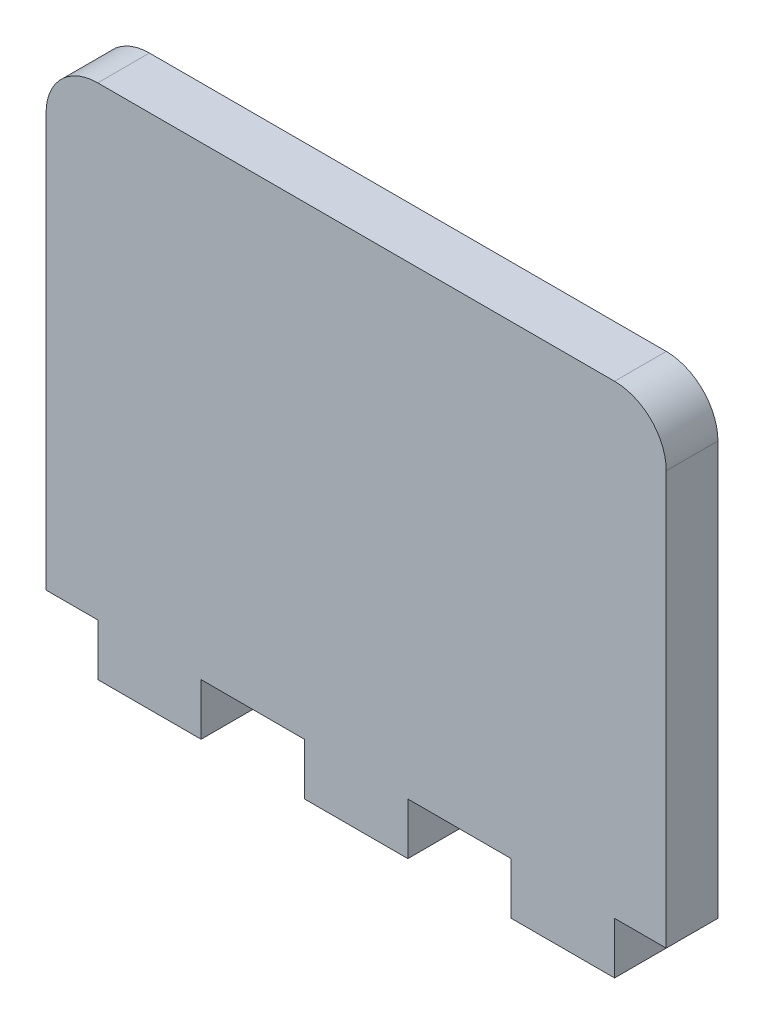
ISO-10303-21;
HEADER;
FILE_DESCRIPTION(('STEP AP214'),'2;1');
FILE_NAME('part.step','',(''),(''),'','','');
FILE_SCHEMA(('AUTOMOTIVE_DESIGN { 1 0 10303 214 1 1 1 1 }'));
ENDSEC;
DATA;
#1=APPLICATION_CONTEXT('core data for automotive mechanical design processes');
#2=APPLICATION_PROTOCOL_DEFINITION('international standard','automotive_design',2000,#1);
#3=PRODUCT_CONTEXT('',#1,'mechanical');
#4=PRODUCT('Part','Part','',(#3));
#5=PRODUCT_RELATED_PRODUCT_CATEGORY('part','',(#4));
#6=PRODUCT_DEFINITION_FORMATION('','',#4);
#7=PRODUCT_DEFINITION_CONTEXT('part definition',#1,'design');
#8=PRODUCT_DEFINITION('design','',#6,#7);
#9=PRODUCT_DEFINITION_SHAPE('','',#8);
#10=(LENGTH_UNIT() NAMED_UNIT(*) SI_UNIT(.MILLI.,.METRE.));
#11=(NAMED_UNIT(*) PLANE_ANGLE_UNIT() SI_UNIT($,.RADIAN.));
#12=(NAMED_UNIT(*) SI_UNIT($,.STERADIAN.) SOLID_ANGLE_UNIT());
#13=UNCERTAINTY_MEASURE_WITH_UNIT(LENGTH_MEASURE(1.E-05),#10,'distance_accuracy_value','');
#14=(GEOMETRIC_REPRESENTATION_CONTEXT(3) GLOBAL_UNCERTAINTY_ASSIGNED_CONTEXT((#13)) GLOBAL_UNIT_ASSIGNED_CONTEXT((#10,
#11,#12)) REPRESENTATION_CONTEXT('',''));
#15=CARTESIAN_POINT('',(0.,0.,0.));
#16=DIRECTION('',(0.,0.,1.));
#17=DIRECTION('',(1.,0.,0.));
#18=AXIS2_PLACEMENT_3D('',#15,#16,#17);
#19=CARTESIAN_POINT('',(0.,0.,3.175));
#20=DIRECTION('',(1.,0.,0.));
#21=DIRECTION('',(0.,0.,-1.));
#22=AXIS2_PLACEMENT_3D('',#19,#20,#21);
#23=PLANE('',#22);
#24=DIRECTION('',(0.,-1.,0.));
#25=VECTOR('',#24,1.);
#26=CARTESIAN_POINT('',(0.,0.,3.175));
#27=LINE('',#26,#25);
#28=CARTESIAN_POINT('',(0.,25.4,3.175));
#29=VERTEX_POINT('',#28);
#30=CARTESIAN_POINT('',(0.,0.,3.175));
#31=VERTEX_POINT('',#30);
#32=EDGE_CURVE('E158',#29,#31,#27,.T.);
#33=ORIENTED_EDGE('',*,*,#32,.F.);
#34=DIRECTION('',(0.,0.,-1.));
#35=VECTOR('',#34,1.);
#36=CARTESIAN_POINT('',(0.,25.4,3.175));
#37=LINE('',#36,#35);
#38=CARTESIAN_POINT('',(0.,25.4,0.));
#39=VERTEX_POINT('',#38);
#40=EDGE_CURVE('E11',#29,#39,#37,.T.);
#41=ORIENTED_EDGE('',*,*,#40,.T.);
#42=DIRECTION('',(0.,-1.,0.));
#43=VECTOR('',#42,1.);
#44=CARTESIAN_POINT('',(0.,0.,0.));
#45=LINE('',#44,#43);
#46=CARTESIAN_POINT('',(0.,0.,0.));
#47=VERTEX_POINT('',#46);
#48=EDGE_CURVE('E178',#39,#47,#45,.T.);
#49=ORIENTED_EDGE('',*,*,#48,.T.);
#50=DIRECTION('',(0.,0.,-1.));
#51=VECTOR('',#50,1.);
#52=CARTESIAN_POINT('',(0.,0.,3.175));
#53=LINE('',#52,#51);
#54=EDGE_CURVE('E171',#31,#47,#53,.T.);
#55=ORIENTED_EDGE('',*,*,#54,.F.);
#56=EDGE_LOOP('',(#33,#41,#49,#55));
#57=FACE_BOUND('',#56,.T.);
#58=ADVANCED_FACE('F33',(#57),#23,.F.);
#59=CARTESIAN_POINT('',(0.,0.,3.175));
#60=DIRECTION('',(0.,1.,0.));
#61=DIRECTION('',(0.,0.,1.));
#62=AXIS2_PLACEMENT_3D('',#59,#60,#61);
#63=PLANE('',#62);
#64=DIRECTION('',(1.,0.,0.));
#65=VECTOR('',#64,1.);
#66=CARTESIAN_POINT('',(0.,0.,0.));
#67=LINE('',#66,#65);
#68=CARTESIAN_POINT('',(3.175,0.,0.));
#69=VERTEX_POINT('',#68);
#70=EDGE_CURVE('E272',#47,#69,#67,.T.);
#71=ORIENTED_EDGE('',*,*,#70,.T.);
#72=DIRECTION('',(0.,0.,-1.));
#73=VECTOR('',#72,1.);
#74=CARTESIAN_POINT('',(3.175,0.,3.175));
#75=LINE('',#74,#73);
#76=CARTESIAN_POINT('',(3.175,0.,3.175));
#77=VERTEX_POINT('',#76);
#78=EDGE_CURVE('E173',#77,#69,#75,.T.);
#79=ORIENTED_EDGE('',*,*,#78,.F.);
#80=DIRECTION('',(1.,0.,0.));
#81=VECTOR('',#80,1.);
#82=CARTESIAN_POINT('',(0.,0.,3.175));
#83=LINE('',#82,#81);
#84=EDGE_CURVE('E161',#31,#77,#83,.T.);
#85=ORIENTED_EDGE('',*,*,#84,.F.);
#86=ORIENTED_EDGE('',*,*,#54,.T.);
#87=EDGE_LOOP('',(#71,#79,#85,#86));
#88=FACE_BOUND('',#87,.T.);
#89=ADVANCED_FACE('F170',(#88),#63,.F.);
#90=CARTESIAN_POINT('',(3.175,0.,3.175));
#91=DIRECTION('',(1.,0.,0.));
#92=DIRECTION('',(0.,1.,0.));
#93=AXIS2_PLACEMENT_3D('',#90,#91,#92);
#94=PLANE('',#93);
#95=DIRECTION('',(0.,-1.,0.));
#96=VECTOR('',#95,1.);
#97=CARTESIAN_POINT('',(3.175,0.,0.));
#98=LINE('',#97,#96);
#99=CARTESIAN_POINT('',(3.175,-3.175,0.));
#100=VERTEX_POINT('',#99);
#101=EDGE_CURVE('E266',#69,#100,#98,.T.);
#102=ORIENTED_EDGE('',*,*,#101,.T.);
#103=DIRECTION('',(0.,0.,-1.));
#104=VECTOR('',#103,1.);
#105=CARTESIAN_POINT('',(3.175,-3.175,3.175));
#106=LINE('',#105,#104);
#107=CARTESIAN_POINT('',(3.175,-3.175,3.175));
#108=VERTEX_POINT('',#107);
#109=EDGE_CURVE('E184',#108,#100,#106,.T.);
#110=ORIENTED_EDGE('',*,*,#109,.F.);
#111=DIRECTION('',(0.,-1.,0.));
#112=VECTOR('',#111,1.);
#113=CARTESIAN_POINT('',(3.175,0.,3.175));
#114=LINE('',#113,#112);
#115=EDGE_CURVE('E175',#77,#108,#114,.T.);
#116=ORIENTED_EDGE('',*,*,#115,.F.);
#117=ORIENTED_EDGE('',*,*,#78,.T.);
#118=EDGE_LOOP('',(#102,#110,#116,#117));
#119=FACE_BOUND('',#118,.T.);
#120=ADVANCED_FACE('F306',(#119),#94,.F.);
#121=CARTESIAN_POINT('',(3.175,-3.175,3.175));
#122=DIRECTION('',(0.,1.,0.));
#123=DIRECTION('',(0.,0.,1.));
#124=AXIS2_PLACEMENT_3D('',#121,#122,#123);
#125=PLANE('',#124);
#126=DIRECTION('',(1.,0.,0.));
#127=VECTOR('',#126,1.);
#128=CARTESIAN_POINT('',(3.175,-3.175,0.));
#129=LINE('',#128,#127);
#130=CARTESIAN_POINT('',(9.525,-3.175,0.));
#131=VERTEX_POINT('',#130);
#132=EDGE_CURVE('E261',#100,#131,#129,.T.);
#133=ORIENTED_EDGE('',*,*,#132,.T.);
#134=DIRECTION('',(0.,0.,-1.));
#135=VECTOR('',#134,1.);
#136=CARTESIAN_POINT('',(9.525,-3.175,3.175));
#137=LINE('',#136,#135);
#138=CARTESIAN_POINT('',(9.525,-3.175,3.175));
#139=VERTEX_POINT('',#138);
#140=EDGE_CURVE('E252',#139,#131,#137,.T.);
#141=ORIENTED_EDGE('',*,*,#140,.F.);
#142=DIRECTION('',(1.,0.,0.));
#143=VECTOR('',#142,1.);
#144=CARTESIAN_POINT('',(3.175,-3.175,3.175));
#145=LINE('',#144,#143);
#146=EDGE_CURVE('E262',#108,#139,#145,.T.);
#147=ORIENTED_EDGE('',*,*,#146,.F.);
#148=ORIENTED_EDGE('',*,*,#109,.T.);
#149=EDGE_LOOP('',(#133,#141,#147,#148));
#150=FACE_BOUND('',#149,.T.);
#151=ADVANCED_FACE('F259',(#150),#125,.F.);
#152=CARTESIAN_POINT('',(9.525,0.,3.175));
#153=DIRECTION('',(-1.,0.,0.));
#154=DIRECTION('',(0.,0.,1.));
#155=AXIS2_PLACEMENT_3D('',#152,#153,#154);
#156=PLANE('',#155);
#157=DIRECTION('',(0.,1.,0.));
#158=VECTOR('',#157,1.);
#159=CARTESIAN_POINT('',(9.525,0.,0.));
#160=LINE('',#159,#158);
#161=CARTESIAN_POINT('',(9.525,0.,0.));
#162=VERTEX_POINT('',#161);
#163=EDGE_CURVE('E268',#131,#162,#160,.T.);
#164=ORIENTED_EDGE('',*,*,#163,.T.);
#165=DIRECTION('',(0.,0.,-1.));
#166=VECTOR('',#165,1.);
#167=CARTESIAN_POINT('',(9.525,0.,3.175));
#168=LINE('',#167,#166);
#169=CARTESIAN_POINT('',(9.525,0.,3.175));
#170=VERTEX_POINT('',#169);
#171=EDGE_CURVE('E249',#170,#162,#168,.T.);
#172=ORIENTED_EDGE('',*,*,#171,.F.);
#173=DIRECTION('',(0.,1.,0.));
#174=VECTOR('',#173,1.);
#175=CARTESIAN_POINT('',(9.525,0.,3.175));
#176=LINE('',#175,#174);
#177=EDGE_CURVE('E308',#139,#170,#176,.T.);
#178=ORIENTED_EDGE('',*,*,#177,.F.);
#179=ORIENTED_EDGE('',*,*,#140,.T.);
#180=EDGE_LOOP('',(#164,#172,#178,#179));
#181=FACE_BOUND('',#180,.T.);
#182=ADVANCED_FACE('F358',(#181),#156,.F.);
#183=CARTESIAN_POINT('',(9.525,0.,3.175));
#184=DIRECTION('',(0.,1.,0.));
#185=DIRECTION('',(0.,0.,1.));
#186=AXIS2_PLACEMENT_3D('',#183,#184,#185);
#187=PLANE('',#186);
#188=DIRECTION('',(1.,0.,0.));
#189=VECTOR('',#188,1.);
#190=CARTESIAN_POINT('',(9.525,0.,0.));
#191=LINE('',#190,#189);
#192=CARTESIAN_POINT('',(15.875,0.,0.));
#193=VERTEX_POINT('',#192);
#194=EDGE_CURVE('E270',#162,#193,#191,.T.);
#195=ORIENTED_EDGE('',*,*,#194,.T.);
#196=DIRECTION('',(0.,0.,-1.));
#197=VECTOR('',#196,1.);
#198=CARTESIAN_POINT('',(15.875,0.,3.175));
#199=LINE('',#198,#197);
#200=CARTESIAN_POINT('',(15.875,0.,3.175));
#201=VERTEX_POINT('',#200);
#202=EDGE_CURVE('E246',#201,#193,#199,.T.);
#203=ORIENTED_EDGE('',*,*,#202,.F.);
#204=DIRECTION('',(1.,0.,0.));
#205=VECTOR('',#204,1.);
#206=CARTESIAN_POINT('',(9.525,0.,3.175));
#207=LINE('',#206,#205);
#208=EDGE_CURVE('E312',#170,#201,#207,.T.);
#209=ORIENTED_EDGE('',*,*,#208,.F.);
#210=ORIENTED_EDGE('',*,*,#171,.T.);
#211=EDGE_LOOP('',(#195,#203,#209,#210));
#212=FACE_BOUND('',#211,.T.);
#213=ADVANCED_FACE('F354',(#212),#187,.F.);
#214=CARTESIAN_POINT('',(15.875,0.,3.175));
#215=DIRECTION('',(1.,0.,0.));
#216=DIRECTION('',(0.,1.,0.));
#217=AXIS2_PLACEMENT_3D('',#214,#215,#216);
#218=PLANE('',#217);
#219=DIRECTION('',(0.,-1.,0.));
#220=VECTOR('',#219,1.);
#221=CARTESIAN_POINT('',(15.875,0.,0.));
#222=LINE('',#221,#220);
#223=CARTESIAN_POINT('',(15.875,-3.175,0.));
#224=VERTEX_POINT('',#223);
#225=EDGE_CURVE('E277',#193,#224,#222,.T.);
#226=ORIENTED_EDGE('',*,*,#225,.T.);
#227=DIRECTION('',(0.,0.,-1.));
#228=VECTOR('',#227,1.);
#229=CARTESIAN_POINT('',(15.875,-3.175,3.175));
#230=LINE('',#229,#228);
#231=CARTESIAN_POINT('',(15.875,-3.175,3.175));
#232=VERTEX_POINT('',#231);
#233=EDGE_CURVE('E243',#232,#224,#230,.T.);
#234=ORIENTED_EDGE('',*,*,#233,.F.);
#235=DIRECTION('',(0.,-1.,0.));
#236=VECTOR('',#235,1.);
#237=CARTESIAN_POINT('',(15.875,0.,3.175));
#238=LINE('',#237,#236);
#239=EDGE_CURVE('E314',#201,#232,#238,.T.);
#240=ORIENTED_EDGE('',*,*,#239,.F.);
#241=ORIENTED_EDGE('',*,*,#202,.T.);
#242=EDGE_LOOP('',(#226,#234,#240,#241));
#243=FACE_BOUND('',#242,.T.);
#244=ADVANCED_FACE('F350',(#243),#218,.F.);
#245=CARTESIAN_POINT('',(15.875,-3.175,3.175));
#246=DIRECTION('',(0.,1.,0.));
#247=DIRECTION('',(0.,0.,1.));
#248=AXIS2_PLACEMENT_3D('',#245,#246,#247);
#249=PLANE('',#248);
#250=DIRECTION('',(1.,0.,0.));
#251=VECTOR('',#250,1.);
#252=CARTESIAN_POINT('',(15.875,-3.175,0.));
#253=LINE('',#252,#251);
#254=CARTESIAN_POINT('',(22.225,-3.175,0.));
#255=VERTEX_POINT('',#254);
#256=EDGE_CURVE('E279',#224,#255,#253,.T.);
#257=ORIENTED_EDGE('',*,*,#256,.T.);
#258=DIRECTION('',(0.,0.,-1.));
#259=VECTOR('',#258,1.);
#260=CARTESIAN_POINT('',(22.225,-3.175,3.175));
#261=LINE('',#260,#259);
#262=CARTESIAN_POINT('',(22.225,-3.175,3.175));
#263=VERTEX_POINT('',#262);
#264=EDGE_CURVE('E240',#263,#255,#261,.T.);
#265=ORIENTED_EDGE('',*,*,#264,.F.);
#266=DIRECTION('',(1.,0.,0.));
#267=VECTOR('',#266,1.);
#268=CARTESIAN_POINT('',(15.875,-3.175,3.175));
#269=LINE('',#268,#267);
#270=EDGE_CURVE('E316',#232,#263,#269,.T.);
#271=ORIENTED_EDGE('',*,*,#270,.F.);
#272=ORIENTED_EDGE('',*,*,#233,.T.);
#273=EDGE_LOOP('',(#257,#265,#271,#272));
#274=FACE_BOUND('',#273,.T.);
#275=ADVANCED_FACE('F345',(#274),#249,.F.);
#276=CARTESIAN_POINT('',(22.225,0.,3.175));
#277=DIRECTION('',(-1.,0.,0.));
#278=DIRECTION('',(0.,-1.,0.));
#279=AXIS2_PLACEMENT_3D('',#276,#277,#278);
#280=PLANE('',#279);
#281=DIRECTION('',(0.,1.,0.));
#282=VECTOR('',#281,1.);
#283=CARTESIAN_POINT('',(22.225,0.,0.));
#284=LINE('',#283,#282);
#285=CARTESIAN_POINT('',(22.225,0.,0.));
#286=VERTEX_POINT('',#285);
#287=EDGE_CURVE('E281',#255,#286,#284,.T.);
#288=ORIENTED_EDGE('',*,*,#287,.T.);
#289=DIRECTION('',(0.,0.,-1.));
#290=VECTOR('',#289,1.);
#291=CARTESIAN_POINT('',(22.225,0.,3.175));
#292=LINE('',#291,#290);
#293=CARTESIAN_POINT('',(22.225,0.,3.175));
#294=VERTEX_POINT('',#293);
#295=EDGE_CURVE('E237',#294,#286,#292,.T.);
#296=ORIENTED_EDGE('',*,*,#295,.F.);
#297=DIRECTION('',(0.,1.,0.));
#298=VECTOR('',#297,1.);
#299=CARTESIAN_POINT('',(22.225,0.,3.175));
#300=LINE('',#299,#298);
#301=EDGE_CURVE('E318',#263,#294,#300,.T.);
#302=ORIENTED_EDGE('',*,*,#301,.F.);
#303=ORIENTED_EDGE('',*,*,#264,.T.);
#304=EDGE_LOOP('',(#288,#296,#302,#303));
#305=FACE_BOUND('',#304,.T.);
#306=ADVANCED_FACE('F340',(#305),#280,.F.);
#307=CARTESIAN_POINT('',(22.225,0.,3.175));
#308=DIRECTION('',(0.,1.,0.));
#309=DIRECTION('',(0.,0.,1.));
#310=AXIS2_PLACEMENT_3D('',#307,#308,#309);
#311=PLANE('',#310);
#312=DIRECTION('',(1.,0.,0.));
#313=VECTOR('',#312,1.);
#314=CARTESIAN_POINT('',(22.225,0.,0.));
#315=LINE('',#314,#313);
#316=CARTESIAN_POINT('',(28.575,0.,0.));
#317=VERTEX_POINT('',#316);
#318=EDGE_CURVE('E283',#286,#317,#315,.T.);
#319=ORIENTED_EDGE('',*,*,#318,.T.);
#320=DIRECTION('',(0.,0.,-1.));
#321=VECTOR('',#320,1.);
#322=CARTESIAN_POINT('',(28.575,0.,3.175));
#323=LINE('',#322,#321);
#324=CARTESIAN_POINT('',(28.575,0.,3.175));
#325=VERTEX_POINT('',#324);
#326=EDGE_CURVE('E234',#325,#317,#323,.T.);
#327=ORIENTED_EDGE('',*,*,#326,.F.);
#328=DIRECTION('',(1.,0.,0.));
#329=VECTOR('',#328,1.);
#330=CARTESIAN_POINT('',(22.225,0.,3.175));
#331=LINE('',#330,#329);
#332=EDGE_CURVE('E320',#294,#325,#331,.T.);
#333=ORIENTED_EDGE('',*,*,#332,.F.);
#334=ORIENTED_EDGE('',*,*,#295,.T.);
#335=EDGE_LOOP('',(#319,#327,#333,#334));
#336=FACE_BOUND('',#335,.T.);
#337=ADVANCED_FACE('F336',(#336),#311,.F.);
#338=CARTESIAN_POINT('',(28.575,0.,3.175));
#339=DIRECTION('',(1.,0.,0.));
#340=DIRECTION('',(0.,0.,-1.));
#341=AXIS2_PLACEMENT_3D('',#338,#339,#340);
#342=PLANE('',#341);
#343=DIRECTION('',(0.,-1.,0.));
#344=VECTOR('',#343,1.);
#345=CARTESIAN_POINT('',(28.575,0.,0.));
#346=LINE('',#345,#344);
#347=CARTESIAN_POINT('',(28.575,-3.175,0.));
#348=VERTEX_POINT('',#347);
#349=EDGE_CURVE('E285',#317,#348,#346,.T.);
#350=ORIENTED_EDGE('',*,*,#349,.T.);
#351=DIRECTION('',(0.,0.,-1.));
#352=VECTOR('',#351,1.);
#353=CARTESIAN_POINT('',(28.575,-3.175,3.175));
#354=LINE('',#353,#352);
#355=CARTESIAN_POINT('',(28.575,-3.175,3.175));
#356=VERTEX_POINT('',#355);
#357=EDGE_CURVE('E231',#356,#348,#354,.T.);
#358=ORIENTED_EDGE('',*,*,#357,.F.);
#359=DIRECTION('',(0.,-1.,0.));
#360=VECTOR('',#359,1.);
#361=CARTESIAN_POINT('',(28.575,0.,3.175));
#362=LINE('',#361,#360);
#363=EDGE_CURVE('E322',#325,#356,#362,.T.);
#364=ORIENTED_EDGE('',*,*,#363,.F.);
#365=ORIENTED_EDGE('',*,*,#326,.T.);
#366=EDGE_LOOP('',(#350,#358,#364,#365));
#367=FACE_BOUND('',#366,.T.);
#368=ADVANCED_FACE('F332',(#367),#342,.F.);
#369=CARTESIAN_POINT('',(28.575,-3.175,3.175));
#370=DIRECTION('',(0.,1.,0.));
#371=DIRECTION('',(0.,0.,1.));
#372=AXIS2_PLACEMENT_3D('',#369,#370,#371);
#373=PLANE('',#372);
#374=DIRECTION('',(1.,0.,0.));
#375=VECTOR('',#374,1.);
#376=CARTESIAN_POINT('',(28.575,-3.175,0.));
#377=LINE('',#376,#375);
#378=CARTESIAN_POINT('',(34.925,-3.175,0.));
#379=VERTEX_POINT('',#378);
#380=EDGE_CURVE('E287',#348,#379,#377,.T.);
#381=ORIENTED_EDGE('',*,*,#380,.T.);
#382=DIRECTION('',(0.,0.,-1.));
#383=VECTOR('',#382,1.);
#384=CARTESIAN_POINT('',(34.925,-3.175,3.175));
#385=LINE('',#384,#383);
#386=CARTESIAN_POINT('',(34.925,-3.175,3.175));
#387=VERTEX_POINT('',#386);
#388=EDGE_CURVE('E228',#387,#379,#385,.T.);
#389=ORIENTED_EDGE('',*,*,#388,.F.);
#390=DIRECTION('',(1.,0.,0.));
#391=VECTOR('',#390,1.);
#392=CARTESIAN_POINT('',(28.575,-3.175,3.175));
#393=LINE('',#392,#391);
#394=EDGE_CURVE('E302',#356,#387,#393,.T.);
#395=ORIENTED_EDGE('',*,*,#394,.F.);
#396=ORIENTED_EDGE('',*,*,#357,.T.);
#397=EDGE_LOOP('',(#381,#389,#395,#396));
#398=FACE_BOUND('',#397,.T.);
#399=ADVANCED_FACE('F327',(#398),#373,.F.);
#400=CARTESIAN_POINT('',(34.925,0.,3.175));
#401=DIRECTION('',(-1.,0.,0.));
#402=DIRECTION('',(0.,0.,1.));
#403=AXIS2_PLACEMENT_3D('',#400,#401,#402);
#404=PLANE('',#403);
#405=DIRECTION('',(0.,1.,0.));
#406=VECTOR('',#405,1.);
#407=CARTESIAN_POINT('',(34.925,0.,0.));
#408=LINE('',#407,#406);
#409=CARTESIAN_POINT('',(34.925,0.,0.));
#410=VERTEX_POINT('',#409);
#411=EDGE_CURVE('E220',#379,#410,#408,.T.);
#412=ORIENTED_EDGE('',*,*,#411,.T.);
#413=DIRECTION('',(0.,0.,-1.));
#414=VECTOR('',#413,1.);
#415=CARTESIAN_POINT('',(34.925,0.,3.175));
#416=LINE('',#415,#414);
#417=CARTESIAN_POINT('',(34.925,0.,3.175));
#418=VERTEX_POINT('',#417);
#419=EDGE_CURVE('E225',#418,#410,#416,.T.);
#420=ORIENTED_EDGE('',*,*,#419,.F.);
#421=DIRECTION('',(0.,1.,0.));
#422=VECTOR('',#421,1.);
#423=CARTESIAN_POINT('',(34.925,0.,3.175));
#424=LINE('',#423,#422);
#425=EDGE_CURVE('E299',#387,#418,#424,.T.);
#426=ORIENTED_EDGE('',*,*,#425,.F.);
#427=ORIENTED_EDGE('',*,*,#388,.T.);
#428=EDGE_LOOP('',(#412,#420,#426,#427));
#429=FACE_BOUND('',#428,.T.);
#430=ADVANCED_FACE('F291',(#429),#404,.F.);
#431=CARTESIAN_POINT('',(34.925,0.,3.175));
#432=DIRECTION('',(0.,1.,0.));
#433=DIRECTION('',(0.,0.,1.));
#434=AXIS2_PLACEMENT_3D('',#431,#432,#433);
#435=PLANE('',#434);
#436=DIRECTION('',(1.,0.,0.));
#437=VECTOR('',#436,1.);
#438=CARTESIAN_POINT('',(34.925,0.,0.));
#439=LINE('',#438,#437);
#440=CARTESIAN_POINT('',(38.1,0.,0.));
#441=VERTEX_POINT('',#440);
#442=EDGE_CURVE('E217',#410,#441,#439,.T.);
#443=ORIENTED_EDGE('',*,*,#442,.T.);
#444=DIRECTION('',(0.,0.,-1.));
#445=VECTOR('',#444,1.);
#446=CARTESIAN_POINT('',(38.1,0.,3.175));
#447=LINE('',#446,#445);
#448=CARTESIAN_POINT('',(38.1,0.,3.175));
#449=VERTEX_POINT('',#448);
#450=EDGE_CURVE('E206',#449,#441,#447,.T.);
#451=ORIENTED_EDGE('',*,*,#450,.F.);
#452=DIRECTION('',(1.,0.,0.));
#453=VECTOR('',#452,1.);
#454=CARTESIAN_POINT('',(34.925,0.,3.175));
#455=LINE('',#454,#453);
#456=EDGE_CURVE('E298',#418,#449,#455,.T.);
#457=ORIENTED_EDGE('',*,*,#456,.F.);
#458=ORIENTED_EDGE('',*,*,#419,.T.);
#459=EDGE_LOOP('',(#443,#451,#457,#458));
#460=FACE_BOUND('',#459,.T.);
#461=ADVANCED_FACE('F297',(#460),#435,.F.);
#462=CARTESIAN_POINT('',(38.1,0.,3.175));
#463=DIRECTION('',(-1.,0.,0.));
#464=DIRECTION('',(0.,0.,1.));
#465=AXIS2_PLACEMENT_3D('',#462,#463,#464);
#466=PLANE('',#465);
#467=DIRECTION('',(0.,1.,0.));
#468=VECTOR('',#467,1.);
#469=CARTESIAN_POINT('',(38.1,0.,0.));
#470=LINE('',#469,#468);
#471=CARTESIAN_POINT('',(38.1,25.4,0.));
#472=VERTEX_POINT('',#471);
#473=EDGE_CURVE('E213',#441,#472,#470,.T.);
#474=ORIENTED_EDGE('',*,*,#473,.T.);
#475=DIRECTION('',(0.,0.,-1.));
#476=VECTOR('',#475,1.);
#477=CARTESIAN_POINT('',(38.1,25.4,3.175));
#478=LINE('',#477,#476);
#479=CARTESIAN_POINT('',(38.1,25.4,3.175));
#480=VERTEX_POINT('',#479);
#481=EDGE_CURVE('E56',#472,#480,#478,.F.);
#482=ORIENTED_EDGE('',*,*,#481,.T.);
#483=DIRECTION('',(0.,1.,0.));
#484=VECTOR('',#483,1.);
#485=CARTESIAN_POINT('',(38.1,0.,3.175));
#486=LINE('',#485,#484);
#487=EDGE_CURVE('E198',#449,#480,#486,.T.);
#488=ORIENTED_EDGE('',*,*,#487,.F.);
#489=ORIENTED_EDGE('',*,*,#450,.T.);
#490=EDGE_LOOP('',(#474,#482,#488,#489));
#491=FACE_BOUND('',#490,.T.);
#492=ADVANCED_FACE('F215',(#491),#466,.F.);
#493=CARTESIAN_POINT('',(0.,28.575,3.175));
#494=DIRECTION('',(0.,-1.,0.));
#495=DIRECTION('',(0.,0.,-1.));
#496=AXIS2_PLACEMENT_3D('',#493,#494,#495);
#497=PLANE('',#496);
#498=DIRECTION('',(-1.,0.,0.));
#499=VECTOR('',#498,1.);
#500=CARTESIAN_POINT('',(0.,28.575,3.175));
#501=LINE('',#500,#499);
#502=CARTESIAN_POINT('',(34.925,28.575,3.175));
#503=VERTEX_POINT('',#502);
#504=CARTESIAN_POINT('',(3.175,28.575,3.175));
#505=VERTEX_POINT('',#504);
#506=EDGE_CURVE('E197',#503,#505,#501,.T.);
#507=ORIENTED_EDGE('',*,*,#506,.F.);
#508=DIRECTION('',(0.,0.,-1.));
#509=VECTOR('',#508,1.);
#510=CARTESIAN_POINT('',(34.925,28.575,3.175));
#511=LINE('',#510,#509);
#512=CARTESIAN_POINT('',(34.925,28.575,0.));
#513=VERTEX_POINT('',#512);
#514=EDGE_CURVE('E182',#503,#513,#511,.T.);
#515=ORIENTED_EDGE('',*,*,#514,.T.);
#516=DIRECTION('',(-1.,0.,0.));
#517=VECTOR('',#516,1.);
#518=CARTESIAN_POINT('',(0.,28.575,0.));
#519=LINE('',#518,#517);
#520=CARTESIAN_POINT('',(3.175,28.575,0.));
#521=VERTEX_POINT('',#520);
#522=EDGE_CURVE('E166',#513,#521,#519,.T.);
#523=ORIENTED_EDGE('',*,*,#522,.T.);
#524=DIRECTION('',(0.,0.,-1.));
#525=VECTOR('',#524,1.);
#526=CARTESIAN_POINT('',(3.175,28.575,3.175));
#527=LINE('',#526,#525);
#528=EDGE_CURVE('E180',#521,#505,#527,.F.);
#529=ORIENTED_EDGE('',*,*,#528,.T.);
#530=EDGE_LOOP('',(#507,#515,#523,#529));
#531=FACE_BOUND('',#530,.T.);
#532=ADVANCED_FACE('F202',(#531),#497,.F.);
#533=CARTESIAN_POINT('',(0.,28.575,3.175));
#534=DIRECTION('',(0.,0.,-1.));
#535=DIRECTION('',(-1.,0.,0.));
#536=AXIS2_PLACEMENT_3D('',#533,#534,#535);
#537=PLANE('',#536);
#538=ORIENTED_EDGE('',*,*,#487,.T.);
#539=CARTESIAN_POINT('',(34.925,25.4,3.175));
#540=DIRECTION('',(0.,0.,-1.));
#541=DIRECTION('',(-1.,0.,0.));
#542=AXIS2_PLACEMENT_3D('',#539,#540,#541);
#543=CIRCLE('',#542,3.175);
#544=EDGE_CURVE('E41',#480,#503,#543,.F.);
#545=ORIENTED_EDGE('',*,*,#544,.T.);
#546=ORIENTED_EDGE('',*,*,#506,.T.);
#547=CARTESIAN_POINT('',(3.175,25.4,3.175));
#548=DIRECTION('',(0.,0.,-1.));
#549=DIRECTION('',(-1.,0.,0.));
#550=AXIS2_PLACEMENT_3D('',#547,#548,#549);
#551=CIRCLE('',#550,3.175);
#552=EDGE_CURVE('E48',#505,#29,#551,.F.);
#553=ORIENTED_EDGE('',*,*,#552,.T.);
#554=ORIENTED_EDGE('',*,*,#32,.T.);
#555=ORIENTED_EDGE('',*,*,#84,.T.);
#556=ORIENTED_EDGE('',*,*,#115,.T.);
#557=ORIENTED_EDGE('',*,*,#146,.T.);
#558=ORIENTED_EDGE('',*,*,#177,.T.);
#559=ORIENTED_EDGE('',*,*,#208,.T.);
#560=ORIENTED_EDGE('',*,*,#239,.T.);
#561=ORIENTED_EDGE('',*,*,#270,.T.);
#562=ORIENTED_EDGE('',*,*,#301,.T.);
#563=ORIENTED_EDGE('',*,*,#332,.T.);
#564=ORIENTED_EDGE('',*,*,#363,.T.);
#565=ORIENTED_EDGE('',*,*,#394,.T.);
#566=ORIENTED_EDGE('',*,*,#425,.T.);
#567=ORIENTED_EDGE('',*,*,#456,.T.);
#568=EDGE_LOOP('',(#538,#545,#546,#553,#554,#555,#556,#557,#558,#559,#560,#561,#562,#563,#564,
#565,#566,#567));
#569=FACE_BOUND('',#568,.T.);
#570=ADVANCED_FACE('F160',(#569),#537,.F.);
#571=CARTESIAN_POINT('',(0.,28.575,0.));
#572=DIRECTION('',(0.,0.,-1.));
#573=DIRECTION('',(-1.,0.,0.));
#574=AXIS2_PLACEMENT_3D('',#571,#572,#573);
#575=PLANE('',#574);
#576=ORIENTED_EDGE('',*,*,#522,.F.);
#577=CARTESIAN_POINT('',(34.925,25.4,0.));
#578=DIRECTION('',(0.,0.,-1.));
#579=DIRECTION('',(-1.,0.,0.));
#580=AXIS2_PLACEMENT_3D('',#577,#578,#579);
#581=CIRCLE('',#580,3.175);
#582=EDGE_CURVE('E192',#513,#472,#581,.T.);
#583=ORIENTED_EDGE('',*,*,#582,.T.);
#584=ORIENTED_EDGE('',*,*,#473,.F.);
#585=ORIENTED_EDGE('',*,*,#442,.F.);
#586=ORIENTED_EDGE('',*,*,#411,.F.);
#587=ORIENTED_EDGE('',*,*,#380,.F.);
#588=ORIENTED_EDGE('',*,*,#349,.F.);
#589=ORIENTED_EDGE('',*,*,#318,.F.);
#590=ORIENTED_EDGE('',*,*,#287,.F.);
#591=ORIENTED_EDGE('',*,*,#256,.F.);
#592=ORIENTED_EDGE('',*,*,#225,.F.);
#593=ORIENTED_EDGE('',*,*,#194,.F.);
#594=ORIENTED_EDGE('',*,*,#163,.F.);
#595=ORIENTED_EDGE('',*,*,#132,.F.);
#596=ORIENTED_EDGE('',*,*,#101,.F.);
#597=ORIENTED_EDGE('',*,*,#70,.F.);
#598=ORIENTED_EDGE('',*,*,#48,.F.);
#599=CARTESIAN_POINT('',(3.175,25.4,0.));
#600=DIRECTION('',(0.,0.,-1.));
#601=DIRECTION('',(-1.,0.,0.));
#602=AXIS2_PLACEMENT_3D('',#599,#600,#601);
#603=CIRCLE('',#602,3.175);
#604=EDGE_CURVE('E190',#39,#521,#603,.T.);
#605=ORIENTED_EDGE('',*,*,#604,.T.);
#606=EDGE_LOOP('',(#576,#583,#584,#585,#586,#587,#588,#589,#590,#591,#592,#593,#594,#595,#596,
#597,#598,#605));
#607=FACE_BOUND('',#606,.T.);
#608=ADVANCED_FACE('F211',(#607),#575,.T.);
#609=CARTESIAN_POINT('',(34.925,25.4,3.175));
#610=DIRECTION('',(0.,0.,-1.));
#611=DIRECTION('',(-1.,0.,0.));
#612=AXIS2_PLACEMENT_3D('',#609,#610,#611);
#613=CYLINDRICAL_SURFACE('',#612,3.175);
#614=ORIENTED_EDGE('',*,*,#544,.F.);
#615=ORIENTED_EDGE('',*,*,#481,.F.);
#616=ORIENTED_EDGE('',*,*,#582,.F.);
#617=ORIENTED_EDGE('',*,*,#514,.F.);
#618=EDGE_LOOP('',(#614,#615,#616,#617));
#619=FACE_BOUND('',#618,.T.);
#620=ADVANCED_FACE('F208',(#619),#613,.T.);
#621=CARTESIAN_POINT('',(3.175,25.4,3.175));
#622=DIRECTION('',(0.,0.,-1.));
#623=DIRECTION('',(-1.,0.,0.));
#624=AXIS2_PLACEMENT_3D('',#621,#622,#623);
#625=CYLINDRICAL_SURFACE('',#624,3.175);
#626=ORIENTED_EDGE('',*,*,#552,.F.);
#627=ORIENTED_EDGE('',*,*,#528,.F.);
#628=ORIENTED_EDGE('',*,*,#604,.F.);
#629=ORIENTED_EDGE('',*,*,#40,.F.);
#630=EDGE_LOOP('',(#626,#627,#628,#629));
#631=FACE_BOUND('',#630,.T.);
#632=ADVANCED_FACE('F35',(#631),#625,.T.);
#633=CLOSED_SHELL('',(#58,#89,#120,#151,#182,#213,#244,#275,#306,#337,#368,#399,#430,#461,#492,
#532,#570,#608,#620,#632));
#634=MANIFOLD_SOLID_BREP('B2',#633);
#635=ADVANCED_BREP_SHAPE_REPRESENTATION('',(#18,#634),#14);
#636=SHAPE_DEFINITION_REPRESENTATION(#9,#635);
ENDSEC;
END-ISO-10303-21;
